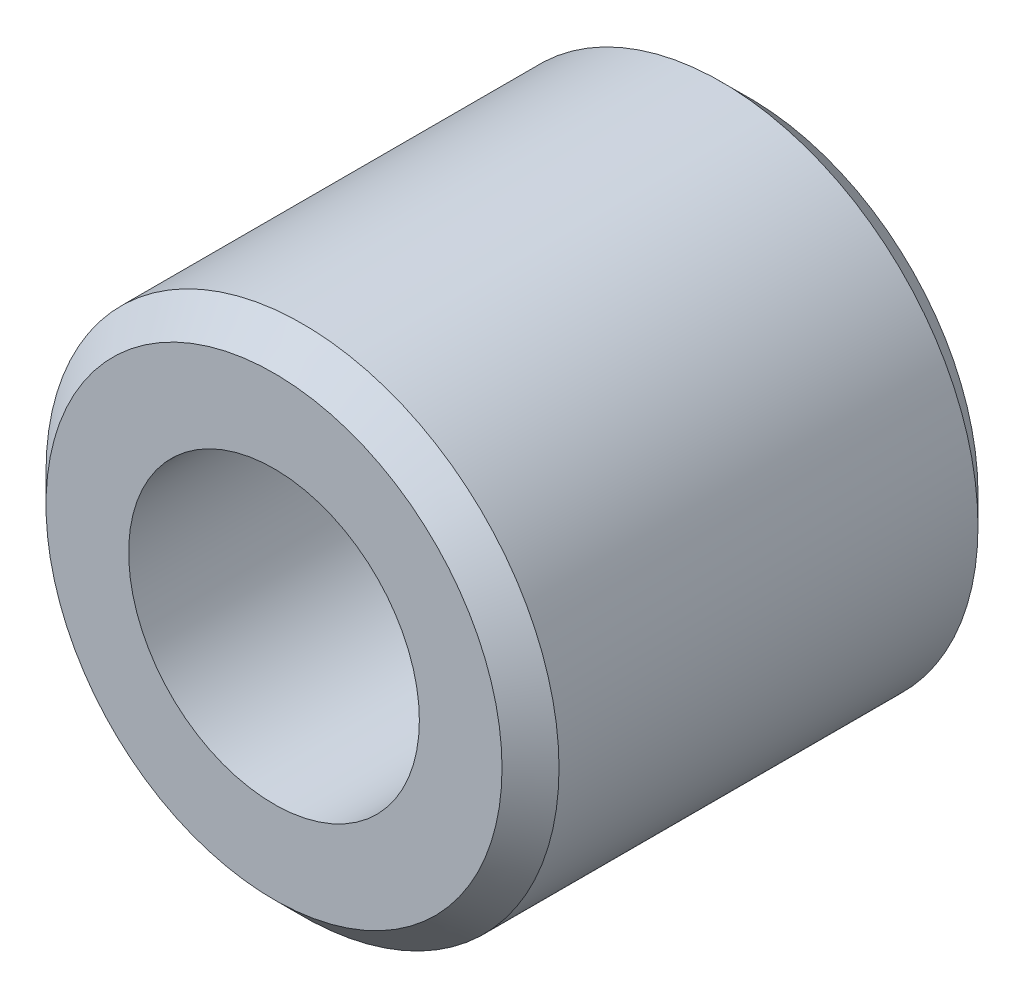
ISO-10303-21;
HEADER;
FILE_DESCRIPTION(('STEP AP214'),'2;1');
FILE_NAME('part.step','',(''),(''),'','','');
FILE_SCHEMA(('AUTOMOTIVE_DESIGN { 1 0 10303 214 1 1 1 1 }'));
ENDSEC;
DATA;
#1=APPLICATION_CONTEXT('core data for automotive mechanical design processes');
#2=APPLICATION_PROTOCOL_DEFINITION('international standard','automotive_design',2000,#1);
#3=PRODUCT_CONTEXT('',#1,'mechanical');
#4=PRODUCT('Part','Part','',(#3));
#5=PRODUCT_RELATED_PRODUCT_CATEGORY('part','',(#4));
#6=PRODUCT_DEFINITION_FORMATION('','',#4);
#7=PRODUCT_DEFINITION_CONTEXT('part definition',#1,'design');
#8=PRODUCT_DEFINITION('design','',#6,#7);
#9=PRODUCT_DEFINITION_SHAPE('','',#8);
#10=(LENGTH_UNIT() NAMED_UNIT(*) SI_UNIT(.MILLI.,.METRE.));
#11=(NAMED_UNIT(*) PLANE_ANGLE_UNIT() SI_UNIT($,.RADIAN.));
#12=(NAMED_UNIT(*) SI_UNIT($,.STERADIAN.) SOLID_ANGLE_UNIT());
#13=UNCERTAINTY_MEASURE_WITH_UNIT(LENGTH_MEASURE(1.E-05),#10,'distance_accuracy_value','');
#14=(GEOMETRIC_REPRESENTATION_CONTEXT(3) GLOBAL_UNCERTAINTY_ASSIGNED_CONTEXT((#13)) GLOBAL_UNIT_ASSIGNED_CONTEXT((#10,
#11,#12)) REPRESENTATION_CONTEXT('',''));
#15=CARTESIAN_POINT('',(0.,0.,0.));
#16=DIRECTION('',(0.,0.,1.));
#17=DIRECTION('',(1.,0.,0.));
#18=AXIS2_PLACEMENT_3D('',#15,#16,#17);
#19=CARTESIAN_POINT('',(0.,0.,8.35));
#20=DIRECTION('',(0.,0.,-1.));
#21=DIRECTION('',(-1.,0.,0.));
#22=AXIS2_PLACEMENT_3D('',#19,#20,#21);
#23=CYLINDRICAL_SURFACE('',#22,4.5);
#24=CARTESIAN_POINT('',(0.,0.,0.499999999999997));
#25=DIRECTION('',(0.,0.,1.));
#26=DIRECTION('',(1.,0.,0.));
#27=AXIS2_PLACEMENT_3D('',#24,#25,#26);
#28=CIRCLE('',#27,4.5);
#29=CARTESIAN_POINT('',(4.5,0.,0.499999999999997));
#30=VERTEX_POINT('',#29);
#31=EDGE_CURVE('E51',#30,#30,#28,.T.);
#32=ORIENTED_EDGE('',*,*,#31,.T.);
#33=EDGE_LOOP('',(#32));
#34=FACE_BOUND('',#33,.T.);
#35=CARTESIAN_POINT('',(0.,0.,7.85));
#36=DIRECTION('',(0.,0.,1.));
#37=DIRECTION('',(1.,0.,0.));
#38=AXIS2_PLACEMENT_3D('',#35,#36,#37);
#39=CIRCLE('',#38,4.5);
#40=CARTESIAN_POINT('',(4.5,0.,7.85));
#41=VERTEX_POINT('',#40);
#42=EDGE_CURVE('E54',#41,#41,#39,.F.);
#43=ORIENTED_EDGE('',*,*,#42,.T.);
#44=EDGE_LOOP('',(#43));
#45=FACE_BOUND('',#44,.T.);
#46=ADVANCED_FACE('F39',(#34,#45),#23,.T.);
#47=CARTESIAN_POINT('',(0.,0.,8.35));
#48=DIRECTION('',(0.,0.,1.));
#49=DIRECTION('',(1.,0.,0.));
#50=AXIS2_PLACEMENT_3D('',#47,#48,#49);
#51=PLANE('',#50);
#52=CARTESIAN_POINT('',(0.,0.,8.35));
#53=DIRECTION('',(0.,0.,1.));
#54=DIRECTION('',(1.,0.,0.));
#55=AXIS2_PLACEMENT_3D('',#52,#53,#54);
#56=CIRCLE('',#55,4.);
#57=CARTESIAN_POINT('',(4.,0.,8.35));
#58=VERTEX_POINT('',#57);
#59=EDGE_CURVE('E10',#58,#58,#56,.T.);
#60=ORIENTED_EDGE('',*,*,#59,.T.);
#61=EDGE_LOOP('',(#60));
#62=FACE_BOUND('',#61,.T.);
#63=CARTESIAN_POINT('',(0.,0.,8.35));
#64=DIRECTION('',(0.,0.,1.));
#65=DIRECTION('',(1.,0.,0.));
#66=AXIS2_PLACEMENT_3D('',#63,#64,#65);
#67=CIRCLE('',#66,2.55);
#68=CARTESIAN_POINT('',(2.55,0.,8.35));
#69=VERTEX_POINT('',#68);
#70=EDGE_CURVE('E58',#69,#69,#67,.T.);
#71=ORIENTED_EDGE('',*,*,#70,.F.);
#72=EDGE_LOOP('',(#71));
#73=FACE_BOUND('',#72,.T.);
#74=ADVANCED_FACE('F69',(#62,#73),#51,.T.);
#75=CARTESIAN_POINT('',(0.,0.,0.));
#76=DIRECTION('',(0.,0.,1.));
#77=DIRECTION('',(1.,0.,0.));
#78=AXIS2_PLACEMENT_3D('',#75,#76,#77);
#79=PLANE('',#78);
#80=CARTESIAN_POINT('',(0.,0.,0.));
#81=DIRECTION('',(0.,0.,1.));
#82=DIRECTION('',(1.,0.,0.));
#83=AXIS2_PLACEMENT_3D('',#80,#81,#82);
#84=CIRCLE('',#83,4.);
#85=CARTESIAN_POINT('',(4.,0.,0.));
#86=VERTEX_POINT('',#85);
#87=EDGE_CURVE('E50',#86,#86,#84,.F.);
#88=ORIENTED_EDGE('',*,*,#87,.T.);
#89=EDGE_LOOP('',(#88));
#90=FACE_BOUND('',#89,.T.);
#91=CARTESIAN_POINT('',(0.,0.,0.));
#92=DIRECTION('',(0.,0.,1.));
#93=DIRECTION('',(1.,0.,0.));
#94=AXIS2_PLACEMENT_3D('',#91,#92,#93);
#95=CIRCLE('',#94,2.55);
#96=CARTESIAN_POINT('',(2.55,0.,0.));
#97=VERTEX_POINT('',#96);
#98=EDGE_CURVE('E61',#97,#97,#95,.T.);
#99=ORIENTED_EDGE('',*,*,#98,.T.);
#100=EDGE_LOOP('',(#99));
#101=FACE_BOUND('',#100,.T.);
#102=ADVANCED_FACE('F75',(#90,#101),#79,.F.);
#103=CARTESIAN_POINT('',(0.,0.,8.35));
#104=DIRECTION('',(0.,0.,-1.));
#105=DIRECTION('',(-1.,0.,0.));
#106=AXIS2_PLACEMENT_3D('',#103,#104,#105);
#107=CYLINDRICAL_SURFACE('',#106,2.55);
#108=ORIENTED_EDGE('',*,*,#70,.T.);
#109=EDGE_LOOP('',(#108));
#110=FACE_BOUND('',#109,.T.);
#111=ORIENTED_EDGE('',*,*,#98,.F.);
#112=EDGE_LOOP('',(#111));
#113=FACE_BOUND('',#112,.T.);
#114=ADVANCED_FACE('F70',(#110,#113),#107,.F.);
#115=CARTESIAN_POINT('',(0.,0.,0.499999999999997));
#116=DIRECTION('',(0.,0.,1.));
#117=DIRECTION('',(1.,0.,0.));
#118=AXIS2_PLACEMENT_3D('',#115,#116,#117);
#119=CONICAL_SURFACE('',#118,4.5,0.785398163397449);
#120=ORIENTED_EDGE('',*,*,#87,.F.);
#121=EDGE_LOOP('',(#120));
#122=FACE_BOUND('',#121,.T.);
#123=ORIENTED_EDGE('',*,*,#31,.F.);
#124=EDGE_LOOP('',(#123));
#125=FACE_BOUND('',#124,.T.);
#126=ADVANCED_FACE('F83',(#122,#125),#119,.T.);
#127=CARTESIAN_POINT('',(0.,0.,8.35));
#128=DIRECTION('',(0.,0.,-1.));
#129=DIRECTION('',(-1.,0.,0.));
#130=AXIS2_PLACEMENT_3D('',#127,#128,#129);
#131=CONICAL_SURFACE('',#130,4.,0.785398163397447);
#132=ORIENTED_EDGE('',*,*,#42,.F.);
#133=EDGE_LOOP('',(#132));
#134=FACE_BOUND('',#133,.T.);
#135=ORIENTED_EDGE('',*,*,#59,.F.);
#136=EDGE_LOOP('',(#135));
#137=FACE_BOUND('',#136,.T.);
#138=ADVANCED_FACE('F45',(#134,#137),#131,.T.);
#139=CLOSED_SHELL('',(#46,#74,#102,#114,#126,#138));
#140=MANIFOLD_SOLID_BREP('B2',#139);
#141=ADVANCED_BREP_SHAPE_REPRESENTATION('',(#18,#140),#14);
#142=SHAPE_DEFINITION_REPRESENTATION(#9,#141);
ENDSEC;
END-ISO-10303-21;
